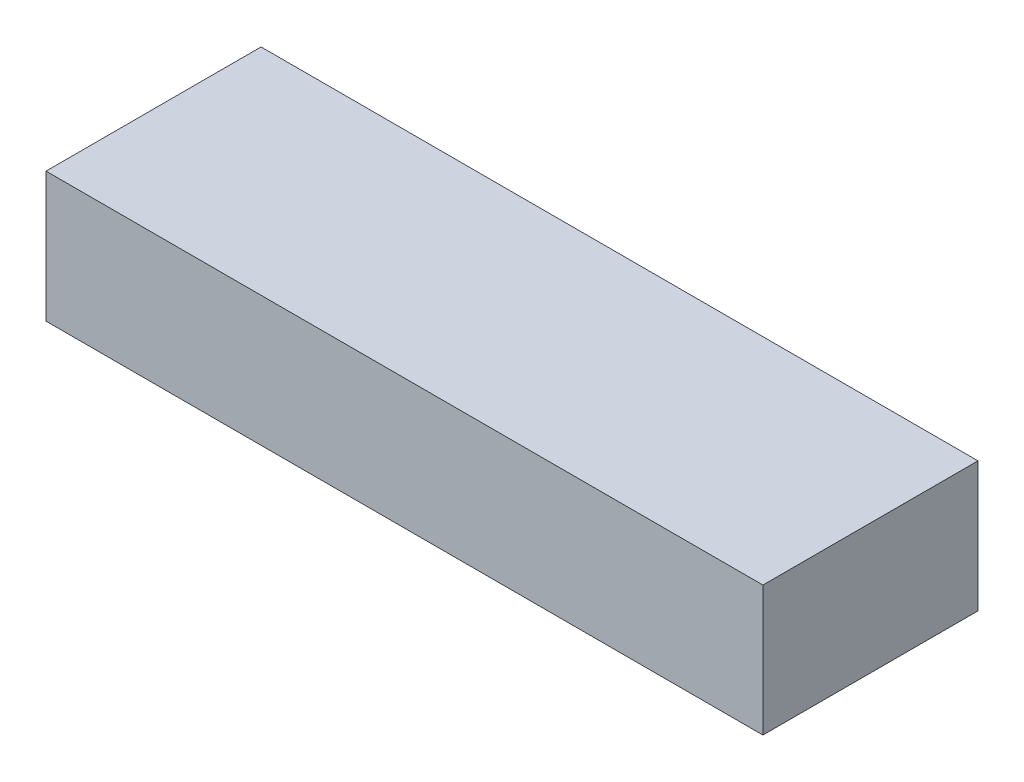
ISO-10303-21;
HEADER;
FILE_DESCRIPTION(('STEP AP214'),'2;1');
FILE_NAME('part.step','',(''),(''),'','','');
FILE_SCHEMA(('AUTOMOTIVE_DESIGN { 1 0 10303 214 1 1 1 1 }'));
ENDSEC;
DATA;
#1=APPLICATION_CONTEXT('core data for automotive mechanical design processes');
#2=APPLICATION_PROTOCOL_DEFINITION('international standard','automotive_design',2000,#1);
#3=PRODUCT_CONTEXT('',#1,'mechanical');
#4=PRODUCT('Part','Part','',(#3));
#5=PRODUCT_RELATED_PRODUCT_CATEGORY('part','',(#4));
#6=PRODUCT_DEFINITION_FORMATION('','',#4);
#7=PRODUCT_DEFINITION_CONTEXT('part definition',#1,'design');
#8=PRODUCT_DEFINITION('design','',#6,#7);
#9=PRODUCT_DEFINITION_SHAPE('','',#8);
#10=(LENGTH_UNIT() NAMED_UNIT(*) SI_UNIT(.MILLI.,.METRE.));
#11=(NAMED_UNIT(*) PLANE_ANGLE_UNIT() SI_UNIT($,.RADIAN.));
#12=(NAMED_UNIT(*) SI_UNIT($,.STERADIAN.) SOLID_ANGLE_UNIT());
#13=UNCERTAINTY_MEASURE_WITH_UNIT(LENGTH_MEASURE(1.E-05),#10,'distance_accuracy_value','');
#14=(GEOMETRIC_REPRESENTATION_CONTEXT(3) GLOBAL_UNCERTAINTY_ASSIGNED_CONTEXT((#13)) GLOBAL_UNIT_ASSIGNED_CONTEXT((#10,
#11,#12)) REPRESENTATION_CONTEXT('',''));
#15=CARTESIAN_POINT('',(0.,0.,0.));
#16=DIRECTION('',(0.,0.,1.));
#17=DIRECTION('',(1.,0.,0.));
#18=AXIS2_PLACEMENT_3D('',#15,#16,#17);
#19=CARTESIAN_POINT('',(80.,29.,24.));
#20=DIRECTION('',(-1.,0.,0.));
#21=DIRECTION('',(0.,0.,1.));
#22=AXIS2_PLACEMENT_3D('',#19,#20,#21);
#23=PLANE('',#22);
#24=DIRECTION('',(0.,0.,-1.));
#25=VECTOR('',#24,1.);
#26=CARTESIAN_POINT('',(80.,0.,24.));
#27=LINE('',#26,#25);
#28=CARTESIAN_POINT('',(80.,0.,24.));
#29=VERTEX_POINT('',#28);
#30=CARTESIAN_POINT('',(80.,0.,-24.));
#31=VERTEX_POINT('',#30);
#32=EDGE_CURVE('E102',#29,#31,#27,.T.);
#33=ORIENTED_EDGE('',*,*,#32,.T.);
#34=DIRECTION('',(0.,-1.,0.));
#35=VECTOR('',#34,1.);
#36=CARTESIAN_POINT('',(80.,29.,-24.));
#37=LINE('',#36,#35);
#38=CARTESIAN_POINT('',(80.,29.,-24.));
#39=VERTEX_POINT('',#38);
#40=EDGE_CURVE('E11',#39,#31,#37,.T.);
#41=ORIENTED_EDGE('',*,*,#40,.F.);
#42=DIRECTION('',(0.,0.,-1.));
#43=VECTOR('',#42,1.);
#44=CARTESIAN_POINT('',(80.,29.,24.));
#45=LINE('',#44,#43);
#46=CARTESIAN_POINT('',(80.,29.,24.));
#47=VERTEX_POINT('',#46);
#48=EDGE_CURVE('E90',#47,#39,#45,.T.);
#49=ORIENTED_EDGE('',*,*,#48,.F.);
#50=DIRECTION('',(0.,-1.,0.));
#51=VECTOR('',#50,1.);
#52=CARTESIAN_POINT('',(80.,29.,24.));
#53=LINE('',#52,#51);
#54=EDGE_CURVE('E98',#47,#29,#53,.T.);
#55=ORIENTED_EDGE('',*,*,#54,.T.);
#56=EDGE_LOOP('',(#33,#41,#49,#55));
#57=FACE_BOUND('',#56,.T.);
#58=ADVANCED_FACE('F39',(#57),#23,.F.);
#59=CARTESIAN_POINT('',(-80.,29.,-24.));
#60=DIRECTION('',(0.,0.,1.));
#61=DIRECTION('',(1.,0.,0.));
#62=AXIS2_PLACEMENT_3D('',#59,#60,#61);
#63=PLANE('',#62);
#64=DIRECTION('',(-1.,0.,0.));
#65=VECTOR('',#64,1.);
#66=CARTESIAN_POINT('',(-80.,0.,-24.));
#67=LINE('',#66,#65);
#68=CARTESIAN_POINT('',(-80.,0.,-24.));
#69=VERTEX_POINT('',#68);
#70=EDGE_CURVE('E94',#31,#69,#67,.T.);
#71=ORIENTED_EDGE('',*,*,#70,.T.);
#72=DIRECTION('',(0.,-1.,0.));
#73=VECTOR('',#72,1.);
#74=CARTESIAN_POINT('',(-80.,29.,-24.));
#75=LINE('',#74,#73);
#76=CARTESIAN_POINT('',(-80.,29.,-24.));
#77=VERTEX_POINT('',#76);
#78=EDGE_CURVE('E47',#77,#69,#75,.T.);
#79=ORIENTED_EDGE('',*,*,#78,.F.);
#80=DIRECTION('',(-1.,0.,0.));
#81=VECTOR('',#80,1.);
#82=CARTESIAN_POINT('',(-80.,29.,-24.));
#83=LINE('',#82,#81);
#84=EDGE_CURVE('E85',#39,#77,#83,.T.);
#85=ORIENTED_EDGE('',*,*,#84,.F.);
#86=ORIENTED_EDGE('',*,*,#40,.T.);
#87=EDGE_LOOP('',(#71,#79,#85,#86));
#88=FACE_BOUND('',#87,.T.);
#89=ADVANCED_FACE('F93',(#88),#63,.F.);
#90=CARTESIAN_POINT('',(-80.,29.,24.));
#91=DIRECTION('',(1.,0.,0.));
#92=DIRECTION('',(0.,0.,-1.));
#93=AXIS2_PLACEMENT_3D('',#90,#91,#92);
#94=PLANE('',#93);
#95=DIRECTION('',(0.,0.,1.));
#96=VECTOR('',#95,1.);
#97=CARTESIAN_POINT('',(-80.,0.,24.));
#98=LINE('',#97,#96);
#99=CARTESIAN_POINT('',(-80.,0.,24.));
#100=VERTEX_POINT('',#99);
#101=EDGE_CURVE('E72',#69,#100,#98,.T.);
#102=ORIENTED_EDGE('',*,*,#101,.T.);
#103=DIRECTION('',(0.,-1.,0.));
#104=VECTOR('',#103,1.);
#105=CARTESIAN_POINT('',(-80.,29.,24.));
#106=LINE('',#105,#104);
#107=CARTESIAN_POINT('',(-80.,29.,24.));
#108=VERTEX_POINT('',#107);
#109=EDGE_CURVE('E95',#108,#100,#106,.T.);
#110=ORIENTED_EDGE('',*,*,#109,.F.);
#111=DIRECTION('',(0.,0.,1.));
#112=VECTOR('',#111,1.);
#113=CARTESIAN_POINT('',(-80.,29.,24.));
#114=LINE('',#113,#112);
#115=EDGE_CURVE('E88',#77,#108,#114,.T.);
#116=ORIENTED_EDGE('',*,*,#115,.F.);
#117=ORIENTED_EDGE('',*,*,#78,.T.);
#118=EDGE_LOOP('',(#102,#110,#116,#117));
#119=FACE_BOUND('',#118,.T.);
#120=ADVANCED_FACE('F96',(#119),#94,.F.);
#121=CARTESIAN_POINT('',(-80.,29.,24.));
#122=DIRECTION('',(0.,0.,-1.));
#123=DIRECTION('',(-1.,0.,0.));
#124=AXIS2_PLACEMENT_3D('',#121,#122,#123);
#125=PLANE('',#124);
#126=DIRECTION('',(1.,0.,0.));
#127=VECTOR('',#126,1.);
#128=CARTESIAN_POINT('',(-80.,0.,24.));
#129=LINE('',#128,#127);
#130=EDGE_CURVE('E78',#100,#29,#129,.T.);
#131=ORIENTED_EDGE('',*,*,#130,.T.);
#132=ORIENTED_EDGE('',*,*,#54,.F.);
#133=DIRECTION('',(1.,0.,0.));
#134=VECTOR('',#133,1.);
#135=CARTESIAN_POINT('',(-80.,29.,24.));
#136=LINE('',#135,#134);
#137=EDGE_CURVE('E55',#108,#47,#136,.T.);
#138=ORIENTED_EDGE('',*,*,#137,.F.);
#139=ORIENTED_EDGE('',*,*,#109,.T.);
#140=EDGE_LOOP('',(#131,#132,#138,#139));
#141=FACE_BOUND('',#140,.T.);
#142=ADVANCED_FACE('F109',(#141),#125,.F.);
#143=CARTESIAN_POINT('',(0.,29.,0.));
#144=DIRECTION('',(0.,-1.,0.));
#145=DIRECTION('',(0.,0.,-1.));
#146=AXIS2_PLACEMENT_3D('',#143,#144,#145);
#147=PLANE('',#146);
#148=ORIENTED_EDGE('',*,*,#48,.T.);
#149=ORIENTED_EDGE('',*,*,#84,.T.);
#150=ORIENTED_EDGE('',*,*,#115,.T.);
#151=ORIENTED_EDGE('',*,*,#137,.T.);
#152=EDGE_LOOP('',(#148,#149,#150,#151));
#153=FACE_BOUND('',#152,.T.);
#154=ADVANCED_FACE('F86',(#153),#147,.F.);
#155=CARTESIAN_POINT('',(0.,0.,0.));
#156=DIRECTION('',(0.,-1.,0.));
#157=DIRECTION('',(0.,0.,-1.));
#158=AXIS2_PLACEMENT_3D('',#155,#156,#157);
#159=PLANE('',#158);
#160=ORIENTED_EDGE('',*,*,#32,.F.);
#161=ORIENTED_EDGE('',*,*,#130,.F.);
#162=ORIENTED_EDGE('',*,*,#101,.F.);
#163=ORIENTED_EDGE('',*,*,#70,.F.);
#164=EDGE_LOOP('',(#160,#161,#162,#163));
#165=FACE_BOUND('',#164,.T.);
#166=ADVANCED_FACE('F112',(#165),#159,.T.);
#167=CLOSED_SHELL('',(#58,#89,#120,#142,#154,#166));
#168=MANIFOLD_SOLID_BREP('B2',#167);
#169=ADVANCED_BREP_SHAPE_REPRESENTATION('',(#18,#168),#14);
#170=SHAPE_DEFINITION_REPRESENTATION(#9,#169);
ENDSEC;
END-ISO-10303-21;
